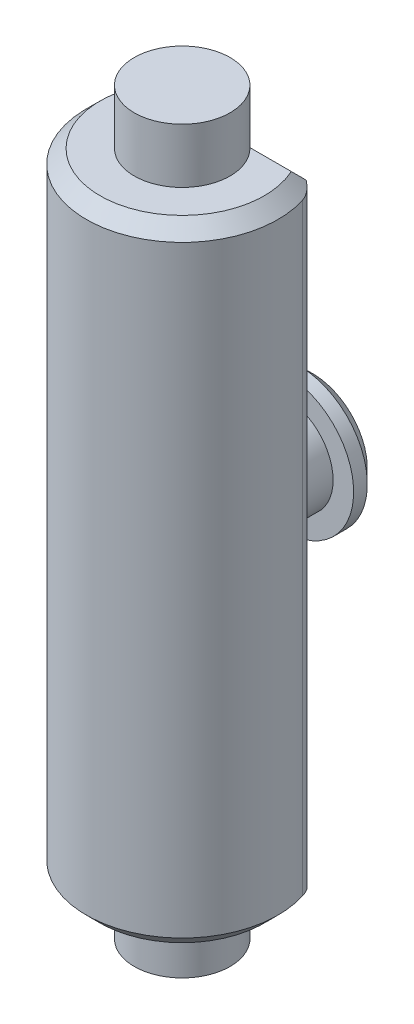
ISO-10303-21;
HEADER;
FILE_DESCRIPTION(('STEP AP214'),'2;1');
FILE_NAME('part.step','',(''),(''),'','','');
FILE_SCHEMA(('AUTOMOTIVE_DESIGN { 1 0 10303 214 1 1 1 1 }'));
ENDSEC;
DATA;
#1=APPLICATION_CONTEXT('core data for automotive mechanical design processes');
#2=APPLICATION_PROTOCOL_DEFINITION('international standard','automotive_design',2000,#1);
#3=PRODUCT_CONTEXT('',#1,'mechanical');
#4=PRODUCT('Part','Part','',(#3));
#5=PRODUCT_RELATED_PRODUCT_CATEGORY('part','',(#4));
#6=PRODUCT_DEFINITION_FORMATION('','',#4);
#7=PRODUCT_DEFINITION_CONTEXT('part definition',#1,'design');
#8=PRODUCT_DEFINITION('design','',#6,#7);
#9=PRODUCT_DEFINITION_SHAPE('','',#8);
#10=(LENGTH_UNIT() NAMED_UNIT(*) SI_UNIT(.MILLI.,.METRE.));
#11=(NAMED_UNIT(*) PLANE_ANGLE_UNIT() SI_UNIT($,.RADIAN.));
#12=(NAMED_UNIT(*) SI_UNIT($,.STERADIAN.) SOLID_ANGLE_UNIT());
#13=UNCERTAINTY_MEASURE_WITH_UNIT(LENGTH_MEASURE(1.E-05),#10,'distance_accuracy_value','');
#14=(GEOMETRIC_REPRESENTATION_CONTEXT(3) GLOBAL_UNCERTAINTY_ASSIGNED_CONTEXT((#13)) GLOBAL_UNIT_ASSIGNED_CONTEXT((#10,
#11,#12)) REPRESENTATION_CONTEXT('',''));
#15=CARTESIAN_POINT('',(0.,0.,0.));
#16=DIRECTION('',(0.,0.,1.));
#17=DIRECTION('',(1.,0.,0.));
#18=AXIS2_PLACEMENT_3D('',#15,#16,#17);
#19=CARTESIAN_POINT('',(0.,23.,0.));
#20=DIRECTION('',(0.,-1.,0.));
#21=DIRECTION('',(0.,0.,-1.));
#22=AXIS2_PLACEMENT_3D('',#19,#20,#21);
#23=CYLINDRICAL_SURFACE('',#22,3.5);
#24=CARTESIAN_POINT('',(0.,0.500000000000007,0.));
#25=DIRECTION('',(0.,-1.,0.));
#26=DIRECTION('',(0.,0.,-1.));
#27=AXIS2_PLACEMENT_3D('',#24,#25,#26);
#28=CIRCLE('',#27,3.5);
#29=CARTESIAN_POINT('',(-3.33398139928069,0.500000000000007,-1.06516103442175));
#30=VERTEX_POINT('',#29);
#31=CARTESIAN_POINT('',(3.33398139928069,0.500000000000007,-1.06516103442175));
#32=VERTEX_POINT('',#31);
#33=EDGE_CURVE('E153',#30,#32,#28,.F.);
#34=ORIENTED_EDGE('',*,*,#33,.T.);
#35=DIRECTION('',(0.,-1.,0.));
#36=VECTOR('',#35,1.);
#37=CARTESIAN_POINT('',(3.33398139928069,23.,-1.06516103442175));
#38=LINE('',#37,#36);
#39=CARTESIAN_POINT('',(3.33398139928069,22.5,-1.06516103442175));
#40=VERTEX_POINT('',#39);
#41=EDGE_CURVE('E224',#32,#40,#38,.F.);
#42=ORIENTED_EDGE('',*,*,#41,.T.);
#43=CARTESIAN_POINT('',(0.,22.5,0.));
#44=DIRECTION('',(0.,-1.,0.));
#45=DIRECTION('',(0.,0.,-1.));
#46=AXIS2_PLACEMENT_3D('',#43,#44,#45);
#47=CIRCLE('',#46,3.5);
#48=CARTESIAN_POINT('',(-3.33398139928069,22.5,-1.06516103442175));
#49=VERTEX_POINT('',#48);
#50=EDGE_CURVE('E145',#40,#49,#47,.T.);
#51=ORIENTED_EDGE('',*,*,#50,.T.);
#52=DIRECTION('',(0.,-1.,0.));
#53=VECTOR('',#52,1.);
#54=CARTESIAN_POINT('',(-3.33398139928069,23.,-1.06516103442175));
#55=LINE('',#54,#53);
#56=EDGE_CURVE('E242',#49,#30,#55,.T.);
#57=ORIENTED_EDGE('',*,*,#56,.T.);
#58=EDGE_LOOP('',(#34,#42,#51,#57));
#59=FACE_BOUND('',#58,.T.);
#60=ADVANCED_FACE('F41',(#59),#23,.T.);
#61=CARTESIAN_POINT('',(-3.02481076102027,23.,-1.76082931030125));
#62=DIRECTION('',(0.,0.,1.));
#63=DIRECTION('',(1.,0.,0.));
#64=AXIS2_PLACEMENT_3D('',#61,#62,#63);
#65=PLANE('',#64);
#66=CARTESIAN_POINT('',(0.,11.5,-1.76082931030125));
#67=DIRECTION('',(0.,0.,1.));
#68=DIRECTION('',(1.,0.,0.));
#69=AXIS2_PLACEMENT_3D('',#66,#67,#68);
#70=CIRCLE('',#69,1.75);
#71=CARTESIAN_POINT('',(1.75,11.5,-1.76082931030125));
#72=VERTEX_POINT('',#71);
#73=EDGE_CURVE('E136',#72,#72,#70,.F.);
#74=ORIENTED_EDGE('',*,*,#73,.F.);
#75=EDGE_LOOP('',(#74));
#76=FACE_BOUND('',#75,.T.);
#77=DIRECTION('',(1.,0.,0.));
#78=VECTOR('',#77,1.);
#79=CARTESIAN_POINT('',(-3.02481076102027,22.5,-1.76082931030125));
#80=LINE('',#79,#78);
#81=CARTESIAN_POINT('',(-2.38141528520049,22.5,-1.76082931030125));
#82=VERTEX_POINT('',#81);
#83=CARTESIAN_POINT('',(2.38141528520049,22.5,-1.76082931030125));
#84=VERTEX_POINT('',#83);
#85=EDGE_CURVE('E261',#82,#84,#80,.T.);
#86=ORIENTED_EDGE('',*,*,#85,.T.);
#87=DIRECTION('',(0.,-1.,0.));
#88=VECTOR('',#87,1.);
#89=CARTESIAN_POINT('',(2.38141528520049,23.,-1.76082931030125));
#90=LINE('',#89,#88);
#91=CARTESIAN_POINT('',(2.38141528520049,0.500000000000007,-1.76082931030125));
#92=VERTEX_POINT('',#91);
#93=EDGE_CURVE('E259',#84,#92,#90,.T.);
#94=ORIENTED_EDGE('',*,*,#93,.T.);
#95=DIRECTION('',(-1.,0.,0.));
#96=VECTOR('',#95,1.);
#97=CARTESIAN_POINT('',(-3.02481076102027,0.500000000000007,-1.76082931030125));
#98=LINE('',#97,#96);
#99=CARTESIAN_POINT('',(-2.38141528520049,0.500000000000007,-1.76082931030125));
#100=VERTEX_POINT('',#99);
#101=EDGE_CURVE('E147',#92,#100,#98,.T.);
#102=ORIENTED_EDGE('',*,*,#101,.T.);
#103=DIRECTION('',(0.,-1.,0.));
#104=VECTOR('',#103,1.);
#105=CARTESIAN_POINT('',(-2.38141528520049,23.,-1.76082931030125));
#106=LINE('',#105,#104);
#107=EDGE_CURVE('E164',#100,#82,#106,.F.);
#108=ORIENTED_EDGE('',*,*,#107,.T.);
#109=EDGE_LOOP('',(#86,#94,#102,#108));
#110=FACE_BOUND('',#109,.T.);
#111=ADVANCED_FACE('F264',(#76,#110),#65,.F.);
#112=CARTESIAN_POINT('',(0.,23.,0.));
#113=DIRECTION('',(0.,-1.,0.));
#114=DIRECTION('',(0.,0.,-1.));
#115=AXIS2_PLACEMENT_3D('',#112,#113,#114);
#116=PLANE('',#115);
#117=CARTESIAN_POINT('',(0.,23.,0.));
#118=DIRECTION('',(0.,-1.,0.));
#119=DIRECTION('',(0.,0.,-1.));
#120=AXIS2_PLACEMENT_3D('',#117,#118,#119);
#121=CIRCLE('',#120,3.);
#122=CARTESIAN_POINT('',(-2.72218835687123,23.,-1.26082931030125));
#123=VERTEX_POINT('',#122);
#124=CARTESIAN_POINT('',(2.72218835687123,23.,-1.26082931030125));
#125=VERTEX_POINT('',#124);
#126=EDGE_CURVE('E156',#123,#125,#121,.F.);
#127=ORIENTED_EDGE('',*,*,#126,.T.);
#128=DIRECTION('',(-1.,0.,0.));
#129=VECTOR('',#128,1.);
#130=CARTESIAN_POINT('',(0.,23.,-1.26082931030125));
#131=LINE('',#130,#129);
#132=CARTESIAN_POINT('',(1.21359361002161,23.,-1.26082931030125));
#133=VERTEX_POINT('',#132);
#134=EDGE_CURVE('E128',#125,#133,#131,.T.);
#135=ORIENTED_EDGE('',*,*,#134,.T.);
#136=CARTESIAN_POINT('',(0.,23.,0.));
#137=DIRECTION('',(0.,1.,0.));
#138=DIRECTION('',(0.,0.,1.));
#139=AXIS2_PLACEMENT_3D('',#136,#137,#138);
#140=CIRCLE('',#139,1.75);
#141=CARTESIAN_POINT('',(-1.21359361002161,23.,-1.26082931030125));
#142=VERTEX_POINT('',#141);
#143=EDGE_CURVE('E137',#142,#133,#140,.T.);
#144=ORIENTED_EDGE('',*,*,#143,.F.);
#145=DIRECTION('',(-1.,0.,0.));
#146=VECTOR('',#145,1.);
#147=CARTESIAN_POINT('',(0.,23.,-1.26082931030125));
#148=LINE('',#147,#146);
#149=EDGE_CURVE('E158',#142,#123,#148,.T.);
#150=ORIENTED_EDGE('',*,*,#149,.T.);
#151=EDGE_LOOP('',(#127,#135,#144,#150));
#152=FACE_BOUND('',#151,.T.);
#153=ADVANCED_FACE('F323',(#152),#116,.F.);
#154=CARTESIAN_POINT('',(0.,0.,0.));
#155=DIRECTION('',(0.,-1.,0.));
#156=DIRECTION('',(0.,0.,-1.));
#157=AXIS2_PLACEMENT_3D('',#154,#155,#156);
#158=PLANE('',#157);
#159=CARTESIAN_POINT('',(0.,0.,0.));
#160=DIRECTION('',(0.,-1.,0.));
#161=DIRECTION('',(0.,0.,-1.));
#162=AXIS2_PLACEMENT_3D('',#159,#160,#161);
#163=CIRCLE('',#162,2.99999999999999);
#164=CARTESIAN_POINT('',(2.72218835687122,0.,-1.26082931030124));
#165=VERTEX_POINT('',#164);
#166=CARTESIAN_POINT('',(-2.72218835687122,0.,-1.26082931030124));
#167=VERTEX_POINT('',#166);
#168=EDGE_CURVE('E143',#165,#167,#163,.T.);
#169=ORIENTED_EDGE('',*,*,#168,.T.);
#170=DIRECTION('',(1.,0.,0.));
#171=VECTOR('',#170,1.);
#172=CARTESIAN_POINT('',(3.02481076102027,0.,-1.26082931030124));
#173=LINE('',#172,#171);
#174=CARTESIAN_POINT('',(-1.21359361002162,0.,-1.26082931030124));
#175=VERTEX_POINT('',#174);
#176=EDGE_CURVE('E135',#167,#175,#173,.T.);
#177=ORIENTED_EDGE('',*,*,#176,.T.);
#178=CARTESIAN_POINT('',(0.,0.,0.));
#179=DIRECTION('',(0.,-1.,0.));
#180=DIRECTION('',(0.,0.,-1.));
#181=AXIS2_PLACEMENT_3D('',#178,#179,#180);
#182=CIRCLE('',#181,1.75);
#183=CARTESIAN_POINT('',(1.21359361002162,0.,-1.26082931030124));
#184=VERTEX_POINT('',#183);
#185=EDGE_CURVE('E122',#184,#175,#182,.T.);
#186=ORIENTED_EDGE('',*,*,#185,.F.);
#187=DIRECTION('',(1.,0.,0.));
#188=VECTOR('',#187,1.);
#189=CARTESIAN_POINT('',(3.02481076102027,0.,-1.26082931030124));
#190=LINE('',#189,#188);
#191=EDGE_CURVE('E133',#184,#165,#190,.T.);
#192=ORIENTED_EDGE('',*,*,#191,.T.);
#193=EDGE_LOOP('',(#169,#177,#186,#192));
#194=FACE_BOUND('',#193,.T.);
#195=ADVANCED_FACE('F132',(#194),#158,.T.);
#196=CARTESIAN_POINT('',(0.,25.,0.));
#197=DIRECTION('',(0.,-1.,0.));
#198=DIRECTION('',(0.,0.,-1.));
#199=AXIS2_PLACEMENT_3D('',#196,#197,#198);
#200=CYLINDRICAL_SURFACE('',#199,1.75);
#201=CARTESIAN_POINT('',(0.,25.,0.));
#202=DIRECTION('',(0.,1.,0.));
#203=DIRECTION('',(0.,0.,1.));
#204=AXIS2_PLACEMENT_3D('',#201,#202,#203);
#205=CIRCLE('',#204,1.75);
#206=CARTESIAN_POINT('',(0.,25.,1.75));
#207=VERTEX_POINT('',#206);
#208=EDGE_CURVE('E285',#207,#207,#205,.T.);
#209=ORIENTED_EDGE('',*,*,#208,.F.);
#210=EDGE_LOOP('',(#209));
#211=FACE_BOUND('',#210,.T.);
#212=ORIENTED_EDGE('',*,*,#143,.T.);
#213=CARTESIAN_POINT('',(0.,24.2608293103013,0.));
#214=DIRECTION('',(0.,-0.707106781186545,0.70710678118655));
#215=DIRECTION('',(0.,-0.70710678118655,-0.707106781186545));
#216=AXIS2_PLACEMENT_3D('',#213,#214,#215);
#217=ELLIPSE('',#216,2.47487373415292,1.75);
#218=EDGE_CURVE('E127',#133,#142,#217,.F.);
#219=ORIENTED_EDGE('',*,*,#218,.T.);
#220=EDGE_LOOP('',(#212,#219));
#221=FACE_BOUND('',#220,.T.);
#222=ADVANCED_FACE('F371',(#211,#221),#200,.T.);
#223=CARTESIAN_POINT('',(0.,25.,0.));
#224=DIRECTION('',(0.,1.,0.));
#225=DIRECTION('',(0.,0.,1.));
#226=AXIS2_PLACEMENT_3D('',#223,#224,#225);
#227=PLANE('',#226);
#228=ORIENTED_EDGE('',*,*,#208,.T.);
#229=EDGE_LOOP('',(#228));
#230=FACE_BOUND('',#229,.T.);
#231=ADVANCED_FACE('F367',(#230),#227,.T.);
#232=CARTESIAN_POINT('',(0.,-2.,0.));
#233=DIRECTION('',(0.,1.,0.));
#234=DIRECTION('',(0.,0.,1.));
#235=AXIS2_PLACEMENT_3D('',#232,#233,#234);
#236=CYLINDRICAL_SURFACE('',#235,1.75);
#237=CARTESIAN_POINT('',(0.,-2.,0.));
#238=DIRECTION('',(0.,-1.,0.));
#239=DIRECTION('',(0.,0.,-1.));
#240=AXIS2_PLACEMENT_3D('',#237,#238,#239);
#241=CIRCLE('',#240,1.75);
#242=CARTESIAN_POINT('',(0.,-2.,-1.75));
#243=VERTEX_POINT('',#242);
#244=EDGE_CURVE('E287',#243,#243,#241,.T.);
#245=ORIENTED_EDGE('',*,*,#244,.F.);
#246=EDGE_LOOP('',(#245));
#247=FACE_BOUND('',#246,.T.);
#248=ORIENTED_EDGE('',*,*,#185,.T.);
#249=CARTESIAN_POINT('',(0.,-1.26082931030124,0.));
#250=DIRECTION('',(0.,-0.707106781186548,-0.707106781186547));
#251=DIRECTION('',(0.,0.707106781186547,-0.707106781186548));
#252=AXIS2_PLACEMENT_3D('',#249,#250,#251);
#253=ELLIPSE('',#252,2.47487373415292,1.75);
#254=EDGE_CURVE('E119',#175,#184,#253,.T.);
#255=ORIENTED_EDGE('',*,*,#254,.T.);
#256=EDGE_LOOP('',(#248,#255));
#257=FACE_BOUND('',#256,.T.);
#258=ADVANCED_FACE('F121',(#247,#257),#236,.T.);
#259=CARTESIAN_POINT('',(0.,-2.,0.));
#260=DIRECTION('',(0.,-1.,0.));
#261=DIRECTION('',(0.,0.,-1.));
#262=AXIS2_PLACEMENT_3D('',#259,#260,#261);
#263=PLANE('',#262);
#264=ORIENTED_EDGE('',*,*,#244,.T.);
#265=EDGE_LOOP('',(#264));
#266=FACE_BOUND('',#265,.T.);
#267=ADVANCED_FACE('F360',(#266),#263,.T.);
#268=CARTESIAN_POINT('',(0.,11.5,-3.76082931030125));
#269=DIRECTION('',(0.,0.,1.));
#270=DIRECTION('',(1.,0.,0.));
#271=AXIS2_PLACEMENT_3D('',#268,#269,#270);
#272=CYLINDRICAL_SURFACE('',#271,1.75);
#273=CARTESIAN_POINT('',(0.,11.5,-3.76082931030125));
#274=DIRECTION('',(0.,0.,-1.));
#275=DIRECTION('',(-1.,0.,0.));
#276=AXIS2_PLACEMENT_3D('',#273,#274,#275);
#277=CIRCLE('',#276,1.75);
#278=CARTESIAN_POINT('',(-1.75,11.5,-3.76082931030125));
#279=VERTEX_POINT('',#278);
#280=EDGE_CURVE('E291',#279,#279,#277,.T.);
#281=ORIENTED_EDGE('',*,*,#280,.F.);
#282=EDGE_LOOP('',(#281));
#283=FACE_BOUND('',#282,.T.);
#284=ORIENTED_EDGE('',*,*,#73,.T.);
#285=EDGE_LOOP('',(#284));
#286=FACE_BOUND('',#285,.T.);
#287=ADVANCED_FACE('F354',(#283,#286),#272,.T.);
#288=CARTESIAN_POINT('',(0.,11.5,-4.76082931030125));
#289=DIRECTION('',(0.,0.,1.));
#290=DIRECTION('',(1.,0.,0.));
#291=AXIS2_PLACEMENT_3D('',#288,#289,#290);
#292=CYLINDRICAL_SURFACE('',#291,2.5);
#293=CARTESIAN_POINT('',(0.,11.5,-4.26082931030125));
#294=DIRECTION('',(0.,0.,-1.));
#295=DIRECTION('',(-1.,0.,0.));
#296=AXIS2_PLACEMENT_3D('',#293,#294,#295);
#297=CIRCLE('',#296,2.5);
#298=CARTESIAN_POINT('',(-2.5,11.5,-4.26082931030125));
#299=VERTEX_POINT('',#298);
#300=EDGE_CURVE('E275',#299,#299,#297,.F.);
#301=ORIENTED_EDGE('',*,*,#300,.T.);
#302=EDGE_LOOP('',(#301));
#303=FACE_BOUND('',#302,.T.);
#304=CARTESIAN_POINT('',(0.,11.5,-3.76082931030125));
#305=DIRECTION('',(0.,0.,-1.));
#306=DIRECTION('',(-1.,0.,0.));
#307=AXIS2_PLACEMENT_3D('',#304,#305,#306);
#308=CIRCLE('',#307,2.5);
#309=CARTESIAN_POINT('',(-2.5,11.5,-3.76082931030125));
#310=VERTEX_POINT('',#309);
#311=EDGE_CURVE('E294',#310,#310,#308,.T.);
#312=ORIENTED_EDGE('',*,*,#311,.T.);
#313=EDGE_LOOP('',(#312));
#314=FACE_BOUND('',#313,.T.);
#315=ADVANCED_FACE('F345',(#303,#314),#292,.T.);
#316=CARTESIAN_POINT('',(0.,11.5,-4.76082931030125));
#317=DIRECTION('',(0.,0.,-1.));
#318=DIRECTION('',(-1.,0.,0.));
#319=AXIS2_PLACEMENT_3D('',#316,#317,#318);
#320=PLANE('',#319);
#321=CARTESIAN_POINT('',(0.,11.5,-4.76082931030125));
#322=DIRECTION('',(0.,0.,-1.));
#323=DIRECTION('',(-1.,0.,0.));
#324=AXIS2_PLACEMENT_3D('',#321,#322,#323);
#325=CIRCLE('',#324,0.949999999999996);
#326=CARTESIAN_POINT('',(-0.949999999999996,11.5,-4.76082931030125));
#327=VERTEX_POINT('',#326);
#328=EDGE_CURVE('E267',#327,#327,#325,.F.);
#329=ORIENTED_EDGE('',*,*,#328,.T.);
#330=EDGE_LOOP('',(#329));
#331=FACE_BOUND('',#330,.T.);
#332=CARTESIAN_POINT('',(0.,11.5,-4.76082931030125));
#333=DIRECTION('',(0.,0.,-1.));
#334=DIRECTION('',(-1.,0.,0.));
#335=AXIS2_PLACEMENT_3D('',#332,#333,#334);
#336=CIRCLE('',#335,2.);
#337=CARTESIAN_POINT('',(-2.,11.5,-4.76082931030125));
#338=VERTEX_POINT('',#337);
#339=EDGE_CURVE('E278',#338,#338,#336,.T.);
#340=ORIENTED_EDGE('',*,*,#339,.T.);
#341=EDGE_LOOP('',(#340));
#342=FACE_BOUND('',#341,.T.);
#343=ADVANCED_FACE('F342',(#331,#342),#320,.T.);
#344=CARTESIAN_POINT('',(0.,11.5,-3.76082931030125));
#345=DIRECTION('',(0.,0.,-1.));
#346=DIRECTION('',(-1.,0.,0.));
#347=AXIS2_PLACEMENT_3D('',#344,#345,#346);
#348=PLANE('',#347);
#349=ORIENTED_EDGE('',*,*,#280,.T.);
#350=EDGE_LOOP('',(#349));
#351=FACE_BOUND('',#350,.T.);
#352=ORIENTED_EDGE('',*,*,#311,.F.);
#353=EDGE_LOOP('',(#352));
#354=FACE_BOUND('',#353,.T.);
#355=ADVANCED_FACE('F314',(#351,#354),#348,.F.);
#356=CARTESIAN_POINT('',(0.,11.5,-4.76082931030125));
#357=DIRECTION('',(0.,0.,1.));
#358=DIRECTION('',(1.,0.,0.));
#359=AXIS2_PLACEMENT_3D('',#356,#357,#358);
#360=CONICAL_SURFACE('',#359,2.,0.785398163397447);
#361=ORIENTED_EDGE('',*,*,#300,.F.);
#362=EDGE_LOOP('',(#361));
#363=FACE_BOUND('',#362,.T.);
#364=ORIENTED_EDGE('',*,*,#339,.F.);
#365=EDGE_LOOP('',(#364));
#366=FACE_BOUND('',#365,.T.);
#367=ADVANCED_FACE('F305',(#363,#366),#360,.T.);
#368=CARTESIAN_POINT('',(0.,11.5,-4.26082931030125));
#369=DIRECTION('',(0.,0.,-1.));
#370=DIRECTION('',(-1.,0.,0.));
#371=AXIS2_PLACEMENT_3D('',#368,#369,#370);
#372=CYLINDRICAL_SURFACE('',#371,0.75);
#373=CARTESIAN_POINT('',(0.,11.5,-4.56082931030125));
#374=DIRECTION('',(0.,0.,-1.));
#375=DIRECTION('',(-1.,0.,0.));
#376=AXIS2_PLACEMENT_3D('',#373,#374,#375);
#377=CIRCLE('',#376,0.75);
#378=CARTESIAN_POINT('',(-0.75,11.5,-4.56082931030125));
#379=VERTEX_POINT('',#378);
#380=EDGE_CURVE('E270',#379,#379,#377,.T.);
#381=ORIENTED_EDGE('',*,*,#380,.T.);
#382=EDGE_LOOP('',(#381));
#383=FACE_BOUND('',#382,.T.);
#384=CARTESIAN_POINT('',(0.,11.5,-4.26082931030125));
#385=DIRECTION('',(0.,0.,-1.));
#386=DIRECTION('',(-1.,0.,0.));
#387=AXIS2_PLACEMENT_3D('',#384,#385,#386);
#388=CIRCLE('',#387,0.75);
#389=CARTESIAN_POINT('',(-0.75,11.5,-4.26082931030125));
#390=VERTEX_POINT('',#389);
#391=EDGE_CURVE('E297',#390,#390,#388,.T.);
#392=ORIENTED_EDGE('',*,*,#391,.F.);
#393=EDGE_LOOP('',(#392));
#394=FACE_BOUND('',#393,.T.);
#395=ADVANCED_FACE('F303',(#383,#394),#372,.F.);
#396=CARTESIAN_POINT('',(0.,11.5,-4.26082931030125));
#397=DIRECTION('',(0.,0.,-1.));
#398=DIRECTION('',(-1.,0.,0.));
#399=AXIS2_PLACEMENT_3D('',#396,#397,#398);
#400=PLANE('',#399);
#401=ORIENTED_EDGE('',*,*,#391,.T.);
#402=EDGE_LOOP('',(#401));
#403=FACE_BOUND('',#402,.T.);
#404=ADVANCED_FACE('F301',(#403),#400,.T.);
#405=CARTESIAN_POINT('',(0.,11.5,-4.56082931030125));
#406=DIRECTION('',(0.,0.,-1.));
#407=DIRECTION('',(-1.,0.,0.));
#408=AXIS2_PLACEMENT_3D('',#405,#406,#407);
#409=CONICAL_SURFACE('',#408,0.75,0.785398163397448);
#410=ORIENTED_EDGE('',*,*,#328,.F.);
#411=EDGE_LOOP('',(#410));
#412=FACE_BOUND('',#411,.T.);
#413=ORIENTED_EDGE('',*,*,#380,.F.);
#414=EDGE_LOOP('',(#413));
#415=FACE_BOUND('',#414,.T.);
#416=ADVANCED_FACE('F312',(#412,#415),#409,.F.);
#417=CARTESIAN_POINT('',(0.,0.500000000000007,0.));
#418=DIRECTION('',(0.,1.,0.));
#419=DIRECTION('',(0.,0.,1.));
#420=AXIS2_PLACEMENT_3D('',#417,#418,#419);
#421=CONICAL_SURFACE('',#420,3.5,0.785398163397449);
#422=CARTESIAN_POINT('',(2.72218835687122,0.,-1.26082931030124));
#423=CARTESIAN_POINT('',(2.74857866302201,0.0413081530837236,-1.30213746338496));
#424=CARTESIAN_POINT('',(2.77465160277347,0.0827173078953965,-1.34354661819664));
#425=CARTESIAN_POINT('',(2.82619819125772,0.165717279022931,-1.42654658932417));
#426=CARTESIAN_POINT('',(2.85167189411769,0.20730807852591,-1.46813738882715));
#427=CARTESIAN_POINT('',(2.90205979516724,0.29065778699452,-1.55148709729576));
#428=CARTESIAN_POINT('',(2.92697400284727,0.332416693094446,-1.59324600339569));
#429=CARTESIAN_POINT('',(2.97627811122175,0.416093465440679,-1.67692277574192));
#430=CARTESIAN_POINT('',(3.00066796417851,0.458011345754869,-1.71884065605611));
#431=CARTESIAN_POINT('',(3.02481076102027,0.500000000000007,-1.76082931030125));
#432=B_SPLINE_CURVE_WITH_KNOTS('',3,(#422,#423,#424,#425,#426,#427,#428,#429,#430,#431),
.UNSPECIFIED.,.F.,.F.,(4,2,2,2,4),(0.,0.192306905697528,0.384596373700867,0.576882577520783,
0.769186213732549),.UNSPECIFIED.);
#433=CARTESIAN_POINT('',(2.92931968026241,0.336540957659022,-1.59737026796026));
#434=VERTEX_POINT('',#433);
#435=EDGE_CURVE('E142',#434,#165,#432,.F.);
#436=ORIENTED_EDGE('',*,*,#435,.F.);
#437=CARTESIAN_POINT('',(2.92931968026241,0.336540957659022,-1.59737026796026));
#438=CARTESIAN_POINT('',(2.94883207625441,0.347553326706608,-1.58458929186345));
#439=CARTESIAN_POINT('',(2.96806378749739,0.358130380909599,-1.57101761918527));
#440=CARTESIAN_POINT('',(3.00583864758834,0.378345943831395,-1.54227693366592));
#441=CARTESIAN_POINT('',(3.02438127629252,0.387983752132972,-1.52710674605699));
#442=CARTESIAN_POINT('',(3.07892184930442,0.415453493325655,-1.47904575079286));
#443=CARTESIAN_POINT('',(3.11363535289112,0.431730542185994,-1.44373156230831));
#444=CARTESIAN_POINT('',(3.17831255843887,0.459497157108423,-1.36703537000267));
#445=CARTESIAN_POINT('',(3.20825367301713,0.470964352667535,-1.3256261972223));
#446=CARTESIAN_POINT('',(3.26172104414338,0.4883933668181,-1.23798204442946));
#447=CARTESIAN_POINT('',(3.28527582026721,0.494379955118043,-1.19176983831532));
#448=CARTESIAN_POINT('',(3.31047680749654,0.498323743805158,-1.13102168212942));
#449=CARTESIAN_POINT('',(3.31556192554268,0.498952030105941,-1.11799430001024));
#450=CARTESIAN_POINT('',(3.32518389045271,0.499789736767705,-1.09172996505094));
#451=CARTESIAN_POINT('',(3.32972090855389,0.499999288269367,-1.0784930791333));
#452=CARTESIAN_POINT('',(3.33398139928068,0.500000000000007,-1.06516103442175));
#453=B_SPLINE_CURVE_WITH_KNOTS('',3,(#437,#438,#439,#440,#441,#442,#443,#444,#445,#446,#447,
#448,#449,#450,#451,#452),.UNSPECIFIED.,.F.,.F.,(4,2,2,2,2,2,2,4),(0.,0.0773498138561007,
0.154756874808291,0.310341096074398,0.466641120085772,0.622231204737515,0.664215537275982,
0.706186718967001),.UNSPECIFIED.);
#454=EDGE_CURVE('E236',#434,#32,#453,.T.);
#455=ORIENTED_EDGE('',*,*,#454,.T.);
#456=ORIENTED_EDGE('',*,*,#33,.F.);
#457=CARTESIAN_POINT('',(-3.33398139928069,0.500000000000007,-1.06516103442175));
#458=CARTESIAN_POINT('',(-3.32660165696864,0.500000776450212,-1.08826597577315));
#459=CARTESIAN_POINT('',(-3.31838106069981,0.499369186130279,-1.11108834950808));
#460=CARTESIAN_POINT('',(-3.30033737905094,0.496856095019224,-1.15600988407896));
#461=CARTESIAN_POINT('',(-3.2905148984791,0.494975065146587,-1.17810931410363));
#462=CARTESIAN_POINT('',(-3.25887713987262,0.48750836491593,-1.24286017628507));
#463=CARTESIAN_POINT('',(-3.23480389735748,0.480098670615536,-1.28423614670984));
#464=CARTESIAN_POINT('',(-3.18167118483567,0.460763360507659,-1.36234905706892));
#465=CARTESIAN_POINT('',(-3.15261679173939,0.448842327974974,-1.39909065493067));
#466=CARTESIAN_POINT('',(-3.09057275876247,0.420954456971992,-1.46738664959203));
#467=CARTESIAN_POINT('',(-3.05758070924067,0.40498513437109,-1.49893784175791));
#468=CARTESIAN_POINT('',(-3.00802946760368,0.379463972733397,-1.54041175685606));
#469=CARTESIAN_POINT('',(-2.9925734092892,0.37130352371902,-1.55257917245812));
#470=CARTESIAN_POINT('',(-2.96124760463928,0.354372878124057,-1.57579714983774));
#471=CARTESIAN_POINT('',(-2.94537921423549,0.345604552677583,-1.58685090261135));
#472=CARTESIAN_POINT('',(-2.92931968026876,0.336540957671523,-1.59737026797481));
#473=B_SPLINE_CURVE_WITH_KNOTS('',3,(#457,#458,#459,#460,#461,#462,#463,#464,#465,#466,#467,
#468,#469,#470,#471,#472),.UNSPECIFIED.,.F.,.F.,(4,2,2,2,2,2,2,4),(0.,0.0727145582751911,
0.145401725698171,0.289930890078835,0.434313613155185,0.578785148396707,0.642640633477524,
0.706307612637321),.UNSPECIFIED.);
#474=CARTESIAN_POINT('',(-2.92931968026374,0.33654095766126,-1.5973702679625));
#475=VERTEX_POINT('',#474);
#476=EDGE_CURVE('E243',#30,#475,#473,.T.);
#477=ORIENTED_EDGE('',*,*,#476,.T.);
#478=CARTESIAN_POINT('',(-3.02481076102027,0.500000000000007,-1.76082931030125));
#479=CARTESIAN_POINT('',(-3.00066796417851,0.458011345754869,-1.71884065605611));
#480=CARTESIAN_POINT('',(-2.97627811122175,0.416093465440679,-1.67692277574192));
#481=CARTESIAN_POINT('',(-2.92697400284727,0.332416693094446,-1.59324600339569));
#482=CARTESIAN_POINT('',(-2.90205979516724,0.29065778699452,-1.55148709729576));
#483=CARTESIAN_POINT('',(-2.85167189411769,0.20730807852591,-1.46813738882715));
#484=CARTESIAN_POINT('',(-2.82619819125772,0.165717279022931,-1.42654658932417));
#485=CARTESIAN_POINT('',(-2.77465160277347,0.0827173078953965,-1.34354661819664));
#486=CARTESIAN_POINT('',(-2.74857866302201,0.0413081530837236,-1.30213746338496));
#487=CARTESIAN_POINT('',(-2.72218835687122,0.,-1.26082931030124));
#488=B_SPLINE_CURVE_WITH_KNOTS('',3,(#478,#479,#480,#481,#482,#483,#484,#485,#486,#487),
.UNSPECIFIED.,.F.,.F.,(4,2,2,2,4),(0.,0.192303636211766,0.384589840031682,0.576879308035021,
0.769186213732549),.UNSPECIFIED.);
#489=EDGE_CURVE('E165',#167,#475,#488,.F.);
#490=ORIENTED_EDGE('',*,*,#489,.F.);
#491=ORIENTED_EDGE('',*,*,#168,.F.);
#492=EDGE_LOOP('',(#436,#455,#456,#477,#490,#491));
#493=FACE_BOUND('',#492,.T.);
#494=ADVANCED_FACE('F181',(#493),#421,.T.);
#495=CARTESIAN_POINT('',(-3.02481076102027,0.500000000000007,-1.76082931030125));
#496=DIRECTION('',(0.,-0.707106781186548,-0.707106781186547));
#497=DIRECTION('',(1.,0.,0.));
#498=AXIS2_PLACEMENT_3D('',#495,#496,#497);
#499=PLANE('',#498);
#500=ORIENTED_EDGE('',*,*,#101,.F.);
#501=CARTESIAN_POINT('',(2.38141528520049,-0.49999999999999,-0.760829310301248));
#502=DIRECTION('',(0.,-0.707106781186548,-0.707106781186547));
#503=DIRECTION('',(0.,-0.707106781186547,0.707106781186548));
#504=AXIS2_PLACEMENT_3D('',#501,#502,#503);
#505=ELLIPSE('',#504,1.41421356237309,1.);
#506=EDGE_CURVE('E552',#92,#434,#505,.T.);
#507=ORIENTED_EDGE('',*,*,#506,.T.);
#508=ORIENTED_EDGE('',*,*,#435,.T.);
#509=ORIENTED_EDGE('',*,*,#191,.F.);
#510=ORIENTED_EDGE('',*,*,#254,.F.);
#511=ORIENTED_EDGE('',*,*,#176,.F.);
#512=ORIENTED_EDGE('',*,*,#489,.T.);
#513=CARTESIAN_POINT('',(-2.38141528520049,-0.49999999999999,-0.760829310301248));
#514=DIRECTION('',(0.,-0.707106781186548,-0.707106781186547));
#515=DIRECTION('',(0.,-0.707106781186547,0.707106781186548));
#516=AXIS2_PLACEMENT_3D('',#513,#514,#515);
#517=ELLIPSE('',#516,1.41421356237309,1.);
#518=EDGE_CURVE('E550',#475,#100,#517,.T.);
#519=ORIENTED_EDGE('',*,*,#518,.T.);
#520=EDGE_LOOP('',(#500,#507,#508,#509,#510,#511,#512,#519));
#521=FACE_BOUND('',#520,.T.);
#522=ADVANCED_FACE('F140',(#521),#499,.T.);
#523=CARTESIAN_POINT('',(0.,23.,0.));
#524=DIRECTION('',(0.,-1.,0.));
#525=DIRECTION('',(0.,0.,-1.));
#526=AXIS2_PLACEMENT_3D('',#523,#524,#525);
#527=CONICAL_SURFACE('',#526,3.,0.785398163397445);
#528=ORIENTED_EDGE('',*,*,#50,.F.);
#529=CARTESIAN_POINT('',(3.33398139928069,22.5,-1.06516103442175));
#530=CARTESIAN_POINT('',(3.32660165696864,22.4999992235498,-1.08826597577314));
#531=CARTESIAN_POINT('',(3.31838106069981,22.5006308138697,-1.11108834950808));
#532=CARTESIAN_POINT('',(3.30033737905094,22.5031439049808,-1.15600988407896));
#533=CARTESIAN_POINT('',(3.2905148984791,22.5050249348534,-1.17810931410363));
#534=CARTESIAN_POINT('',(3.25887713987262,22.5124916350841,-1.24286017628507));
#535=CARTESIAN_POINT('',(3.23480389735748,22.5199013293845,-1.28423614670984));
#536=CARTESIAN_POINT('',(3.18167118483567,22.5392366394923,-1.36234905706892));
#537=CARTESIAN_POINT('',(3.15261679173939,22.551157672025,-1.39909065493067));
#538=CARTESIAN_POINT('',(3.09057275876247,22.579045543028,-1.46738664959203));
#539=CARTESIAN_POINT('',(3.05758070924067,22.5950148656289,-1.49893784175791));
#540=CARTESIAN_POINT('',(3.00802946760368,22.6205360272666,-1.54041175685606));
#541=CARTESIAN_POINT('',(2.9925734092892,22.628696476281,-1.55257917245812));
#542=CARTESIAN_POINT('',(2.96124760463928,22.645627121876,-1.57579714983774));
#543=CARTESIAN_POINT('',(2.94537921423549,22.6543954473224,-1.58685090261135));
#544=CARTESIAN_POINT('',(2.92931968026876,22.6634590423285,-1.59737026797481));
#545=B_SPLINE_CURVE_WITH_KNOTS('',3,(#529,#530,#531,#532,#533,#534,#535,#536,#537,#538,#539,
#540,#541,#542,#543,#544),.UNSPECIFIED.,.F.,.F.,(4,2,2,2,2,2,2,4),(0.,0.0727145582751909,
0.14540172569817,0.289930890078835,0.434313613155184,0.578785148396706,0.642640633477524,
0.706307612637321),.UNSPECIFIED.);
#546=CARTESIAN_POINT('',(2.92931968026374,22.6634590423387,-1.5973702679625));
#547=VERTEX_POINT('',#546);
#548=EDGE_CURVE('E57',#40,#547,#545,.T.);
#549=ORIENTED_EDGE('',*,*,#548,.T.);
#550=CARTESIAN_POINT('',(3.02481076102027,22.5,-1.76082931030125));
#551=CARTESIAN_POINT('',(3.00066796417851,22.5419886542451,-1.71884065605611));
#552=CARTESIAN_POINT('',(2.97627811122175,22.5839065345593,-1.67692277574192));
#553=CARTESIAN_POINT('',(2.92697400284728,22.6675833069056,-1.59324600339569));
#554=CARTESIAN_POINT('',(2.90205979516724,22.7093422130055,-1.55148709729576));
#555=CARTESIAN_POINT('',(2.8516718941177,22.7926919214741,-1.46813738882716));
#556=CARTESIAN_POINT('',(2.82619819125773,22.8342827209771,-1.42654658932418));
#557=CARTESIAN_POINT('',(2.77465160277347,22.9172826921046,-1.34354661819664));
#558=CARTESIAN_POINT('',(2.74857866302202,22.9586918469163,-1.30213746338497));
#559=CARTESIAN_POINT('',(2.72218835687123,23.,-1.26082931030125));
#560=B_SPLINE_CURVE_WITH_KNOTS('',3,(#550,#551,#552,#553,#554,#555,#556,#557,#558,#559),
.UNSPECIFIED.,.F.,.F.,(4,2,2,2,4),(0.,0.192303636211763,0.384589840031675,0.576879308035009,
0.769186213732536),.UNSPECIFIED.);
#561=EDGE_CURVE('E174',#125,#547,#560,.F.);
#562=ORIENTED_EDGE('',*,*,#561,.F.);
#563=ORIENTED_EDGE('',*,*,#126,.F.);
#564=CARTESIAN_POINT('',(-2.72218835687123,23.,-1.26082931030125));
#565=CARTESIAN_POINT('',(-2.74857866302202,22.9586918469163,-1.30213746338497));
#566=CARTESIAN_POINT('',(-2.77465160277347,22.9172826921046,-1.34354661819665));
#567=CARTESIAN_POINT('',(-2.82619819125773,22.8342827209771,-1.42654658932418));
#568=CARTESIAN_POINT('',(-2.8516718941177,22.7926919214741,-1.46813738882716));
#569=CARTESIAN_POINT('',(-2.90205979516724,22.7093422130055,-1.55148709729577));
#570=CARTESIAN_POINT('',(-2.92697400284728,22.6675833069056,-1.59324600339569));
#571=CARTESIAN_POINT('',(-2.97627811122175,22.5839065345593,-1.67692277574192));
#572=CARTESIAN_POINT('',(-3.00066796417851,22.5419886542451,-1.71884065605611));
#573=CARTESIAN_POINT('',(-3.02481076102027,22.5,-1.76082931030125));
#574=B_SPLINE_CURVE_WITH_KNOTS('',3,(#564,#565,#566,#567,#568,#569,#570,#571,#572,#573),
.UNSPECIFIED.,.F.,.F.,(4,2,2,2,4),(0.,0.192306905697526,0.38459637370086,0.576882577520778,
0.769186213732536),.UNSPECIFIED.);
#575=CARTESIAN_POINT('',(-2.92931968026234,22.6634590423411,-1.59737026796014));
#576=VERTEX_POINT('',#575);
#577=EDGE_CURVE('E204',#576,#123,#574,.F.);
#578=ORIENTED_EDGE('',*,*,#577,.F.);
#579=CARTESIAN_POINT('',(-2.92931968026234,22.6634590423411,-1.59737026796014));
#580=CARTESIAN_POINT('',(-2.94883207625437,22.6524466732935,-1.58458929186342));
#581=CARTESIAN_POINT('',(-2.96806378749736,22.6418696190904,-1.57101761918527));
#582=CARTESIAN_POINT('',(-3.00583864758833,22.6216540561686,-1.54227693366595));
#583=CARTESIAN_POINT('',(-3.02438127629251,22.612016247867,-1.52710674605701));
#584=CARTESIAN_POINT('',(-3.0789218493044,22.5845465066744,-1.47904575079286));
#585=CARTESIAN_POINT('',(-3.11363535289111,22.568269457814,-1.44373156230832));
#586=CARTESIAN_POINT('',(-3.17831255843886,22.5405028428916,-1.36703537000268));
#587=CARTESIAN_POINT('',(-3.20825367301713,22.5290356473325,-1.3256261972223));
#588=CARTESIAN_POINT('',(-3.26172104414338,22.5116066331819,-1.23798204442946));
#589=CARTESIAN_POINT('',(-3.28527582026722,22.505620044882,-1.19176983831531));
#590=CARTESIAN_POINT('',(-3.31047680749655,22.5016762561948,-1.1310216821294));
#591=CARTESIAN_POINT('',(-3.31556192554268,22.5010479698941,-1.11799430001022));
#592=CARTESIAN_POINT('',(-3.32518389045271,22.5002102632323,-1.09172996505093));
#593=CARTESIAN_POINT('',(-3.3297209085539,22.5000007117306,-1.0784930791333));
#594=CARTESIAN_POINT('',(-3.33398139928069,22.5,-1.06516103442175));
#595=B_SPLINE_CURVE_WITH_KNOTS('',3,(#579,#580,#581,#582,#583,#584,#585,#586,#587,#588,#589,
#590,#591,#592,#593,#594),.UNSPECIFIED.,.F.,.F.,(4,2,2,2,2,2,2,4),(0.,0.077349813856114,
0.154756874808313,0.310341096074422,0.46664112008581,0.622231204737573,0.664215537276031,
0.70618671896704),.UNSPECIFIED.);
#596=EDGE_CURVE('E218',#576,#49,#595,.T.);
#597=ORIENTED_EDGE('',*,*,#596,.T.);
#598=EDGE_LOOP('',(#528,#549,#562,#563,#578,#597));
#599=FACE_BOUND('',#598,.T.);
#600=ADVANCED_FACE('F191',(#599),#527,.T.);
#601=CARTESIAN_POINT('',(0.,23.,-1.26082931030125));
#602=DIRECTION('',(0.,-0.707106781186545,0.70710678118655));
#603=DIRECTION('',(-1.,0.,0.));
#604=AXIS2_PLACEMENT_3D('',#601,#602,#603);
#605=PLANE('',#604);
#606=ORIENTED_EDGE('',*,*,#561,.T.);
#607=CARTESIAN_POINT('',(2.38141528520049,23.5,-0.760829310301248));
#608=DIRECTION('',(0.,-0.707106781186545,0.70710678118655));
#609=DIRECTION('',(0.,-0.70710678118655,-0.707106781186545));
#610=AXIS2_PLACEMENT_3D('',#607,#608,#609);
#611=ELLIPSE('',#610,1.4142135623731,1.);
#612=EDGE_CURVE('E11',#547,#84,#611,.F.);
#613=ORIENTED_EDGE('',*,*,#612,.T.);
#614=ORIENTED_EDGE('',*,*,#85,.F.);
#615=CARTESIAN_POINT('',(-2.38141528520049,23.5,-0.760829310301248));
#616=DIRECTION('',(0.,-0.707106781186545,0.70710678118655));
#617=DIRECTION('',(0.,-0.70710678118655,-0.707106781186545));
#618=AXIS2_PLACEMENT_3D('',#615,#616,#617);
#619=ELLIPSE('',#618,1.4142135623731,1.);
#620=EDGE_CURVE('E50',#82,#576,#619,.F.);
#621=ORIENTED_EDGE('',*,*,#620,.T.);
#622=ORIENTED_EDGE('',*,*,#577,.T.);
#623=ORIENTED_EDGE('',*,*,#149,.F.);
#624=ORIENTED_EDGE('',*,*,#218,.F.);
#625=ORIENTED_EDGE('',*,*,#134,.F.);
#626=EDGE_LOOP('',(#606,#613,#614,#621,#622,#623,#624,#625));
#627=FACE_BOUND('',#626,.T.);
#628=ADVANCED_FACE('F200',(#627),#605,.F.);
#629=CARTESIAN_POINT('',(2.38141528520049,23.,-0.760829310301248));
#630=DIRECTION('',(0.,-1.,0.));
#631=DIRECTION('',(0.,0.,-1.));
#632=AXIS2_PLACEMENT_3D('',#629,#630,#631);
#633=CYLINDRICAL_SURFACE('',#632,1.);
#634=ORIENTED_EDGE('',*,*,#548,.F.);
#635=ORIENTED_EDGE('',*,*,#41,.F.);
#636=ORIENTED_EDGE('',*,*,#454,.F.);
#637=ORIENTED_EDGE('',*,*,#506,.F.);
#638=ORIENTED_EDGE('',*,*,#93,.F.);
#639=ORIENTED_EDGE('',*,*,#612,.F.);
#640=EDGE_LOOP('',(#634,#635,#636,#637,#638,#639));
#641=FACE_BOUND('',#640,.T.);
#642=ADVANCED_FACE('F230',(#641),#633,.T.);
#643=CARTESIAN_POINT('',(-2.38141528520049,23.,-0.760829310301248));
#644=DIRECTION('',(0.,-1.,0.));
#645=DIRECTION('',(0.,0.,-1.));
#646=AXIS2_PLACEMENT_3D('',#643,#644,#645);
#647=CYLINDRICAL_SURFACE('',#646,1.);
#648=ORIENTED_EDGE('',*,*,#620,.F.);
#649=ORIENTED_EDGE('',*,*,#107,.F.);
#650=ORIENTED_EDGE('',*,*,#518,.F.);
#651=ORIENTED_EDGE('',*,*,#476,.F.);
#652=ORIENTED_EDGE('',*,*,#56,.F.);
#653=ORIENTED_EDGE('',*,*,#596,.F.);
#654=EDGE_LOOP('',(#648,#649,#650,#651,#652,#653));
#655=FACE_BOUND('',#654,.T.);
#656=ADVANCED_FACE('F43',(#655),#647,.T.);
#657=CLOSED_SHELL('',(#60,#111,#153,#195,#222,#231,#258,#267,#287,#315,#343,#355,#367,#395,#404,
#416,#494,#522,#600,#628,#642,#656));
#658=MANIFOLD_SOLID_BREP('B2',#657);
#659=ADVANCED_BREP_SHAPE_REPRESENTATION('',(#18,#658),#14);
#660=SHAPE_DEFINITION_REPRESENTATION(#9,#659);
ENDSEC;
END-ISO-10303-21;
